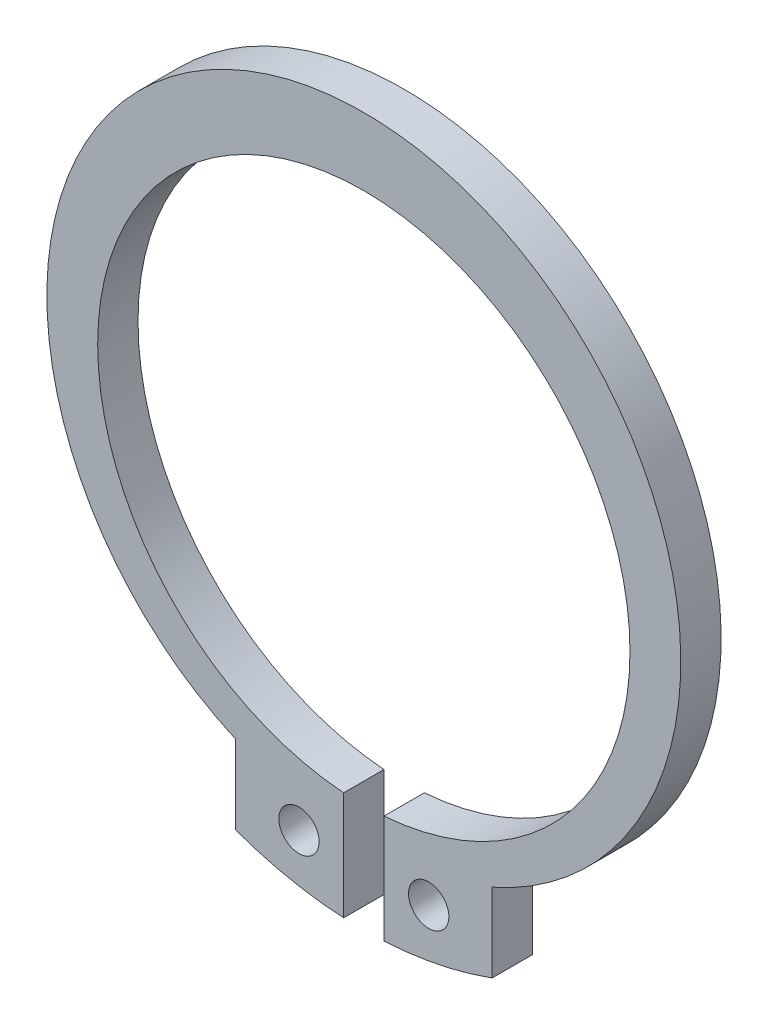
ISO-10303-21;
HEADER;
FILE_DESCRIPTION(('STEP AP214'),'2;1');
FILE_NAME('part.step','',(''),(''),'','','');
FILE_SCHEMA(('AUTOMOTIVE_DESIGN { 1 0 10303 214 1 1 1 1 }'));
ENDSEC;
DATA;
#1=APPLICATION_CONTEXT('core data for automotive mechanical design processes');
#2=APPLICATION_PROTOCOL_DEFINITION('international standard','automotive_design',2000,#1);
#3=PRODUCT_CONTEXT('',#1,'mechanical');
#4=PRODUCT('Part','Part','',(#3));
#5=PRODUCT_RELATED_PRODUCT_CATEGORY('part','',(#4));
#6=PRODUCT_DEFINITION_FORMATION('','',#4);
#7=PRODUCT_DEFINITION_CONTEXT('part definition',#1,'design');
#8=PRODUCT_DEFINITION('design','',#6,#7);
#9=PRODUCT_DEFINITION_SHAPE('','',#8);
#10=(LENGTH_UNIT() NAMED_UNIT(*) SI_UNIT(.MILLI.,.METRE.));
#11=(NAMED_UNIT(*) PLANE_ANGLE_UNIT() SI_UNIT($,.RADIAN.));
#12=(NAMED_UNIT(*) SI_UNIT($,.STERADIAN.) SOLID_ANGLE_UNIT());
#13=UNCERTAINTY_MEASURE_WITH_UNIT(LENGTH_MEASURE(1.E-05),#10,'distance_accuracy_value','');
#14=(GEOMETRIC_REPRESENTATION_CONTEXT(3) GLOBAL_UNCERTAINTY_ASSIGNED_CONTEXT((#13)) GLOBAL_UNIT_ASSIGNED_CONTEXT((#10,
#11,#12)) REPRESENTATION_CONTEXT('',''));
#15=CARTESIAN_POINT('',(0.,0.,0.));
#16=DIRECTION('',(0.,0.,1.));
#17=DIRECTION('',(1.,0.,0.));
#18=AXIS2_PLACEMENT_3D('',#15,#16,#17);
#19=CARTESIAN_POINT('',(-1.25,-23.166300956346,2.5));
#20=DIRECTION('',(-0.999999999999998,0.,0.));
#21=DIRECTION('',(0.,-0.999999999999998,0.));
#22=AXIS2_PLACEMENT_3D('',#19,#20,#21);
#23=PLANE('',#22);
#24=DIRECTION('',(0.,0.999999999999998,0.));
#25=VECTOR('',#24,1.);
#26=CARTESIAN_POINT('',(-1.25,-23.166300956346,0.));
#27=LINE('',#26,#25);
#28=CARTESIAN_POINT('',(-1.25,-23.166300956346,0.));
#29=VERTEX_POINT('',#28);
#30=CARTESIAN_POINT('',(-1.25,-16.4525833837729,0.));
#31=VERTEX_POINT('',#30);
#32=EDGE_CURVE('E112',#29,#31,#27,.T.);
#33=ORIENTED_EDGE('',*,*,#32,.T.);
#34=DIRECTION('',(0.,0.,-0.999999999999995));
#35=VECTOR('',#34,1.);
#36=CARTESIAN_POINT('',(-1.25,-16.4525833837729,2.5));
#37=LINE('',#36,#35);
#38=CARTESIAN_POINT('',(-1.25,-16.4525833837729,2.5));
#39=VERTEX_POINT('',#38);
#40=EDGE_CURVE('E13',#39,#31,#37,.T.);
#41=ORIENTED_EDGE('',*,*,#40,.F.);
#42=DIRECTION('',(0.,0.999999999999998,0.));
#43=VECTOR('',#42,1.);
#44=CARTESIAN_POINT('',(-1.25,-23.166300956346,2.5));
#45=LINE('',#44,#43);
#46=CARTESIAN_POINT('',(-1.25,-23.166300956346,2.5));
#47=VERTEX_POINT('',#46);
#48=EDGE_CURVE('E142',#47,#39,#45,.T.);
#49=ORIENTED_EDGE('',*,*,#48,.F.);
#50=DIRECTION('',(0.,0.,-0.999999999999995));
#51=VECTOR('',#50,1.);
#52=CARTESIAN_POINT('',(-1.25,-23.166300956346,2.5));
#53=LINE('',#52,#51);
#54=EDGE_CURVE('E165',#47,#29,#53,.T.);
#55=ORIENTED_EDGE('',*,*,#54,.T.);
#56=EDGE_LOOP('',(#33,#41,#49,#55));
#57=FACE_BOUND('',#56,.T.);
#58=ADVANCED_FACE('F25',(#57),#23,.F.);
#59=CARTESIAN_POINT('',(0.,0.,2.5));
#60=DIRECTION('',(0.,0.,-0.999999999999995));
#61=DIRECTION('',(-0.999999999999998,0.,0.));
#62=AXIS2_PLACEMENT_3D('',#59,#60,#61);
#63=CYLINDRICAL_SURFACE('',#62,16.5);
#64=CARTESIAN_POINT('',(0.,0.,0.));
#65=DIRECTION('',(0.,0.,0.999999999999995));
#66=DIRECTION('',(0.999999999999998,0.,0.));
#67=AXIS2_PLACEMENT_3D('',#64,#65,#66);
#68=CIRCLE('',#67,16.5);
#69=CARTESIAN_POINT('',(1.25,-16.4525833837729,0.));
#70=VERTEX_POINT('',#69);
#71=EDGE_CURVE('E105',#70,#31,#68,.T.);
#72=ORIENTED_EDGE('',*,*,#71,.F.);
#73=DIRECTION('',(0.,0.,-0.999999999999995));
#74=VECTOR('',#73,1.);
#75=CARTESIAN_POINT('',(1.25,-16.4525833837729,2.5));
#76=LINE('',#75,#74);
#77=CARTESIAN_POINT('',(1.25,-16.4525833837729,2.5));
#78=VERTEX_POINT('',#77);
#79=EDGE_CURVE('E34',#78,#70,#76,.T.);
#80=ORIENTED_EDGE('',*,*,#79,.F.);
#81=CARTESIAN_POINT('',(0.,0.,2.5));
#82=DIRECTION('',(0.,0.,0.999999999999995));
#83=DIRECTION('',(0.999999999999998,0.,0.));
#84=AXIS2_PLACEMENT_3D('',#81,#82,#83);
#85=CIRCLE('',#84,16.5);
#86=EDGE_CURVE('E146',#78,#39,#85,.T.);
#87=ORIENTED_EDGE('',*,*,#86,.T.);
#88=ORIENTED_EDGE('',*,*,#40,.T.);
#89=EDGE_LOOP('',(#72,#80,#87,#88));
#90=FACE_BOUND('',#89,.T.);
#91=ADVANCED_FACE('F106',(#90),#63,.F.);
#92=CARTESIAN_POINT('',(1.25,-23.166300956346,2.5));
#93=DIRECTION('',(-0.999999999999998,0.,0.));
#94=DIRECTION('',(0.,-0.999999999999998,0.));
#95=AXIS2_PLACEMENT_3D('',#92,#93,#94);
#96=PLANE('',#95);
#97=DIRECTION('',(0.,0.999999999999998,0.));
#98=VECTOR('',#97,1.);
#99=CARTESIAN_POINT('',(1.25,-23.166300956346,0.));
#100=LINE('',#99,#98);
#101=CARTESIAN_POINT('',(1.25,-23.166300956346,0.));
#102=VERTEX_POINT('',#101);
#103=EDGE_CURVE('E95',#102,#70,#100,.T.);
#104=ORIENTED_EDGE('',*,*,#103,.F.);
#105=DIRECTION('',(0.,0.,-0.999999999999995));
#106=VECTOR('',#105,1.);
#107=CARTESIAN_POINT('',(1.25,-23.166300956346,2.5));
#108=LINE('',#107,#106);
#109=CARTESIAN_POINT('',(1.25,-23.166300956346,2.5));
#110=VERTEX_POINT('',#109);
#111=EDGE_CURVE('E102',#110,#102,#108,.T.);
#112=ORIENTED_EDGE('',*,*,#111,.F.);
#113=DIRECTION('',(0.,0.999999999999998,0.));
#114=VECTOR('',#113,1.);
#115=CARTESIAN_POINT('',(1.25,-23.166300956346,2.5));
#116=LINE('',#115,#114);
#117=EDGE_CURVE('E97',#110,#78,#116,.T.);
#118=ORIENTED_EDGE('',*,*,#117,.T.);
#119=ORIENTED_EDGE('',*,*,#79,.T.);
#120=EDGE_LOOP('',(#104,#112,#118,#119));
#121=FACE_BOUND('',#120,.T.);
#122=ADVANCED_FACE('F93',(#121),#96,.T.);
#123=CARTESIAN_POINT('',(0.,0.,2.5));
#124=DIRECTION('',(0.,0.,-0.999999999999995));
#125=DIRECTION('',(-0.999999999999998,0.,0.));
#126=AXIS2_PLACEMENT_3D('',#123,#124,#125);
#127=CYLINDRICAL_SURFACE('',#126,23.2);
#128=CARTESIAN_POINT('',(0.,0.,0.));
#129=DIRECTION('',(0.,0.,0.999999999999995));
#130=DIRECTION('',(0.999999999999998,0.,0.));
#131=AXIS2_PLACEMENT_3D('',#128,#129,#130);
#132=CIRCLE('',#131,23.2);
#133=CARTESIAN_POINT('',(7.94999999999987,-21.7953550097263,0.));
#134=VERTEX_POINT('',#133);
#135=EDGE_CURVE('E117',#102,#134,#132,.T.);
#136=ORIENTED_EDGE('',*,*,#135,.T.);
#137=DIRECTION('',(0.,0.,-0.999999999999995));
#138=VECTOR('',#137,1.);
#139=CARTESIAN_POINT('',(7.94999999999987,-21.7953550097263,2.5));
#140=LINE('',#139,#138);
#141=CARTESIAN_POINT('',(7.94999999999987,-21.7953550097263,2.5));
#142=VERTEX_POINT('',#141);
#143=EDGE_CURVE('E180',#142,#134,#140,.T.);
#144=ORIENTED_EDGE('',*,*,#143,.F.);
#145=CARTESIAN_POINT('',(0.,0.,2.5));
#146=DIRECTION('',(0.,0.,0.999999999999995));
#147=DIRECTION('',(0.999999999999998,0.,0.));
#148=AXIS2_PLACEMENT_3D('',#145,#146,#147);
#149=CIRCLE('',#148,23.2);
#150=EDGE_CURVE('E151',#110,#142,#149,.T.);
#151=ORIENTED_EDGE('',*,*,#150,.F.);
#152=ORIENTED_EDGE('',*,*,#111,.T.);
#153=EDGE_LOOP('',(#136,#144,#151,#152));
#154=FACE_BOUND('',#153,.T.);
#155=ADVANCED_FACE('F239',(#154),#127,.T.);
#156=CARTESIAN_POINT('',(7.94999999999987,-21.7953550097263,2.5));
#157=DIRECTION('',(-0.999999999999998,0.,0.));
#158=DIRECTION('',(0.,0.,0.999999999999995));
#159=AXIS2_PLACEMENT_3D('',#156,#157,#158);
#160=PLANE('',#159);
#161=DIRECTION('',(0.,0.999999999999998,0.));
#162=VECTOR('',#161,1.);
#163=CARTESIAN_POINT('',(7.94999999999987,-21.7953550097263,0.));
#164=LINE('',#163,#162);
#165=CARTESIAN_POINT('',(7.94999999999987,-16.9199749582463,0.));
#166=VERTEX_POINT('',#165);
#167=EDGE_CURVE('E125',#134,#166,#164,.T.);
#168=ORIENTED_EDGE('',*,*,#167,.T.);
#169=DIRECTION('',(0.,0.,-0.999999999999995));
#170=VECTOR('',#169,1.);
#171=CARTESIAN_POINT('',(7.94999999999987,-16.9199749582463,2.5));
#172=LINE('',#171,#170);
#173=CARTESIAN_POINT('',(7.94999999999987,-16.9199749582463,2.5));
#174=VERTEX_POINT('',#173);
#175=EDGE_CURVE('E176',#174,#166,#172,.T.);
#176=ORIENTED_EDGE('',*,*,#175,.F.);
#177=DIRECTION('',(0.,0.999999999999998,0.));
#178=VECTOR('',#177,1.);
#179=CARTESIAN_POINT('',(7.94999999999987,-21.7953550097263,2.5));
#180=LINE('',#179,#178);
#181=EDGE_CURVE('E154',#142,#174,#180,.T.);
#182=ORIENTED_EDGE('',*,*,#181,.F.);
#183=ORIENTED_EDGE('',*,*,#143,.T.);
#184=EDGE_LOOP('',(#168,#176,#182,#183));
#185=FACE_BOUND('',#184,.T.);
#186=ADVANCED_FACE('F234',(#185),#160,.F.);
#187=CARTESIAN_POINT('',(0.,1.05,2.5));
#188=DIRECTION('',(0.,0.,-0.999999999999995));
#189=DIRECTION('',(-0.999999999999998,0.,0.));
#190=AXIS2_PLACEMENT_3D('',#187,#188,#189);
#191=CYLINDRICAL_SURFACE('',#190,19.65);
#192=CARTESIAN_POINT('',(0.,1.05,0.));
#193=DIRECTION('',(0.,0.,0.999999999999995));
#194=DIRECTION('',(0.999999999999998,0.,0.));
#195=AXIS2_PLACEMENT_3D('',#192,#193,#194);
#196=CIRCLE('',#195,19.65);
#197=CARTESIAN_POINT('',(-7.95000000000001,-16.9199749582463,0.));
#198=VERTEX_POINT('',#197);
#199=EDGE_CURVE('E131',#166,#198,#196,.T.);
#200=ORIENTED_EDGE('',*,*,#199,.T.);
#201=DIRECTION('',(0.,0.,-0.999999999999995));
#202=VECTOR('',#201,1.);
#203=CARTESIAN_POINT('',(-7.95000000000001,-16.9199749582463,2.5));
#204=LINE('',#203,#202);
#205=CARTESIAN_POINT('',(-7.95000000000001,-16.9199749582463,2.5));
#206=VERTEX_POINT('',#205);
#207=EDGE_CURVE('E173',#206,#198,#204,.T.);
#208=ORIENTED_EDGE('',*,*,#207,.F.);
#209=CARTESIAN_POINT('',(0.,1.05,2.5));
#210=DIRECTION('',(0.,0.,0.999999999999995));
#211=DIRECTION('',(0.999999999999998,0.,0.));
#212=AXIS2_PLACEMENT_3D('',#209,#210,#211);
#213=CIRCLE('',#212,19.65);
#214=EDGE_CURVE('E157',#174,#206,#213,.T.);
#215=ORIENTED_EDGE('',*,*,#214,.F.);
#216=ORIENTED_EDGE('',*,*,#175,.T.);
#217=EDGE_LOOP('',(#200,#208,#215,#216));
#218=FACE_BOUND('',#217,.T.);
#219=ADVANCED_FACE('F231',(#218),#191,.T.);
#220=CARTESIAN_POINT('',(-7.95000000000001,-21.7953550097263,2.5));
#221=DIRECTION('',(-0.999999999999998,0.,0.));
#222=DIRECTION('',(0.,0.,0.999999999999995));
#223=AXIS2_PLACEMENT_3D('',#220,#221,#222);
#224=PLANE('',#223);
#225=DIRECTION('',(0.,0.999999999999998,0.));
#226=VECTOR('',#225,1.);
#227=CARTESIAN_POINT('',(-7.95000000000001,-21.7953550097263,0.));
#228=LINE('',#227,#226);
#229=CARTESIAN_POINT('',(-7.95000000000001,-21.7953550097263,0.));
#230=VERTEX_POINT('',#229);
#231=EDGE_CURVE('E135',#230,#198,#228,.T.);
#232=ORIENTED_EDGE('',*,*,#231,.F.);
#233=DIRECTION('',(0.,0.,-0.999999999999995));
#234=VECTOR('',#233,1.);
#235=CARTESIAN_POINT('',(-7.95000000000001,-21.7953550097263,2.5));
#236=LINE('',#235,#234);
#237=CARTESIAN_POINT('',(-7.95000000000001,-21.7953550097263,2.5));
#238=VERTEX_POINT('',#237);
#239=EDGE_CURVE('E50',#238,#230,#236,.T.);
#240=ORIENTED_EDGE('',*,*,#239,.F.);
#241=DIRECTION('',(0.,0.999999999999998,0.));
#242=VECTOR('',#241,1.);
#243=CARTESIAN_POINT('',(-7.95000000000001,-21.7953550097263,2.5));
#244=LINE('',#243,#242);
#245=EDGE_CURVE('E160',#238,#206,#244,.T.);
#246=ORIENTED_EDGE('',*,*,#245,.T.);
#247=ORIENTED_EDGE('',*,*,#207,.T.);
#248=EDGE_LOOP('',(#232,#240,#246,#247));
#249=FACE_BOUND('',#248,.T.);
#250=ADVANCED_FACE('F227',(#249),#224,.T.);
#251=CARTESIAN_POINT('',(0.,0.,2.5));
#252=DIRECTION('',(0.,0.,-0.999999999999995));
#253=DIRECTION('',(-0.999999999999998,0.,0.));
#254=AXIS2_PLACEMENT_3D('',#251,#252,#253);
#255=CYLINDRICAL_SURFACE('',#254,23.2);
#256=CARTESIAN_POINT('',(0.,0.,0.));
#257=DIRECTION('',(0.,0.,0.999999999999995));
#258=DIRECTION('',(0.999999999999998,0.,0.));
#259=AXIS2_PLACEMENT_3D('',#256,#257,#258);
#260=CIRCLE('',#259,23.2);
#261=EDGE_CURVE('E139',#230,#29,#260,.T.);
#262=ORIENTED_EDGE('',*,*,#261,.T.);
#263=ORIENTED_EDGE('',*,*,#54,.F.);
#264=CARTESIAN_POINT('',(0.,0.,2.5));
#265=DIRECTION('',(0.,0.,0.999999999999995));
#266=DIRECTION('',(0.999999999999998,0.,0.));
#267=AXIS2_PLACEMENT_3D('',#264,#265,#266);
#268=CIRCLE('',#267,23.2);
#269=EDGE_CURVE('E42',#238,#47,#268,.T.);
#270=ORIENTED_EDGE('',*,*,#269,.F.);
#271=ORIENTED_EDGE('',*,*,#239,.T.);
#272=EDGE_LOOP('',(#262,#263,#270,#271));
#273=FACE_BOUND('',#272,.T.);
#274=ADVANCED_FACE('F242',(#273),#255,.T.);
#275=CARTESIAN_POINT('',(0.,0.,2.5));
#276=DIRECTION('',(0.,0.,0.999999999999995));
#277=DIRECTION('',(0.999999999999998,0.,0.));
#278=AXIS2_PLACEMENT_3D('',#275,#276,#277);
#279=PLANE('',#278);
#280=CARTESIAN_POINT('',(4.02,-19.85,2.5));
#281=DIRECTION('',(0.,0.,0.999999999999995));
#282=DIRECTION('',(0.999999999999998,0.,0.));
#283=AXIS2_PLACEMENT_3D('',#280,#281,#282);
#284=CIRCLE('',#283,1.25);
#285=CARTESIAN_POINT('',(4.02,-18.6,2.5));
#286=VERTEX_POINT('',#285);
#287=EDGE_CURVE('E187',#286,#286,#284,.T.);
#288=ORIENTED_EDGE('',*,*,#287,.F.);
#289=EDGE_LOOP('',(#288));
#290=FACE_BOUND('',#289,.T.);
#291=CARTESIAN_POINT('',(-4.02,-19.85,2.5));
#292=DIRECTION('',(0.,0.,0.999999999999995));
#293=DIRECTION('',(0.999999999999998,0.,0.));
#294=AXIS2_PLACEMENT_3D('',#291,#292,#293);
#295=CIRCLE('',#294,1.25);
#296=CARTESIAN_POINT('',(-4.02,-18.6,2.5));
#297=VERTEX_POINT('',#296);
#298=EDGE_CURVE('E145',#297,#297,#295,.T.);
#299=ORIENTED_EDGE('',*,*,#298,.F.);
#300=EDGE_LOOP('',(#299));
#301=FACE_BOUND('',#300,.T.);
#302=ORIENTED_EDGE('',*,*,#48,.T.);
#303=ORIENTED_EDGE('',*,*,#86,.F.);
#304=ORIENTED_EDGE('',*,*,#117,.F.);
#305=ORIENTED_EDGE('',*,*,#150,.T.);
#306=ORIENTED_EDGE('',*,*,#181,.T.);
#307=ORIENTED_EDGE('',*,*,#214,.T.);
#308=ORIENTED_EDGE('',*,*,#245,.F.);
#309=ORIENTED_EDGE('',*,*,#269,.T.);
#310=EDGE_LOOP('',(#302,#303,#304,#305,#306,#307,#308,#309));
#311=FACE_BOUND('',#310,.T.);
#312=ADVANCED_FACE('F240',(#290,#301,#311),#279,.T.);
#313=CARTESIAN_POINT('',(0.,0.,0.));
#314=DIRECTION('',(0.,0.,0.999999999999995));
#315=DIRECTION('',(0.999999999999998,0.,0.));
#316=AXIS2_PLACEMENT_3D('',#313,#314,#315);
#317=PLANE('',#316);
#318=CARTESIAN_POINT('',(4.02,-19.85,0.));
#319=DIRECTION('',(0.,0.,0.999999999999995));
#320=DIRECTION('',(0.999999999999998,0.,0.));
#321=AXIS2_PLACEMENT_3D('',#318,#319,#320);
#322=CIRCLE('',#321,1.25);
#323=CARTESIAN_POINT('',(4.02,-18.6,0.));
#324=VERTEX_POINT('',#323);
#325=EDGE_CURVE('E28',#324,#324,#322,.T.);
#326=ORIENTED_EDGE('',*,*,#325,.T.);
#327=EDGE_LOOP('',(#326));
#328=FACE_BOUND('',#327,.T.);
#329=CARTESIAN_POINT('',(-4.02,-19.85,0.));
#330=DIRECTION('',(0.,0.,0.999999999999995));
#331=DIRECTION('',(0.999999999999998,0.,0.));
#332=AXIS2_PLACEMENT_3D('',#329,#330,#331);
#333=CIRCLE('',#332,1.25);
#334=CARTESIAN_POINT('',(-4.02,-18.6,0.));
#335=VERTEX_POINT('',#334);
#336=EDGE_CURVE('E184',#335,#335,#333,.T.);
#337=ORIENTED_EDGE('',*,*,#336,.T.);
#338=EDGE_LOOP('',(#337));
#339=FACE_BOUND('',#338,.T.);
#340=ORIENTED_EDGE('',*,*,#32,.F.);
#341=ORIENTED_EDGE('',*,*,#261,.F.);
#342=ORIENTED_EDGE('',*,*,#231,.T.);
#343=ORIENTED_EDGE('',*,*,#199,.F.);
#344=ORIENTED_EDGE('',*,*,#167,.F.);
#345=ORIENTED_EDGE('',*,*,#135,.F.);
#346=ORIENTED_EDGE('',*,*,#103,.T.);
#347=ORIENTED_EDGE('',*,*,#71,.T.);
#348=EDGE_LOOP('',(#340,#341,#342,#343,#344,#345,#346,#347));
#349=FACE_BOUND('',#348,.T.);
#350=ADVANCED_FACE('F115',(#328,#339,#349),#317,.F.);
#351=CARTESIAN_POINT('',(-4.02,-19.85,-2.5));
#352=DIRECTION('',(0.,0.,0.999999999999995));
#353=DIRECTION('',(0.,0.999999999999998,0.));
#354=AXIS2_PLACEMENT_3D('',#351,#352,#353);
#355=CYLINDRICAL_SURFACE('',#354,1.25);
#356=CARTESIAN_POINT('',(-4.02,-18.6,2.5));
#357=CARTESIAN_POINT('',(-4.02,-18.6,2.47395833333333));
#358=CARTESIAN_POINT('',(-4.02,-18.6,2.44791666666666));
#359=CARTESIAN_POINT('',(-4.02,-18.6,2.39583333333333));
#360=CARTESIAN_POINT('',(-4.02,-18.6,2.36979166666666));
#361=CARTESIAN_POINT('',(-4.02,-18.6,2.31770833333333));
#362=CARTESIAN_POINT('',(-4.02,-18.6,2.29166666666666));
#363=CARTESIAN_POINT('',(-4.02,-18.6,2.23958333333333));
#364=CARTESIAN_POINT('',(-4.02,-18.6,2.21354166666666));
#365=CARTESIAN_POINT('',(-4.02,-18.6,2.16145833333333));
#366=CARTESIAN_POINT('',(-4.02,-18.6,2.13541666666666));
#367=CARTESIAN_POINT('',(-4.02,-18.6,2.08333333333333));
#368=CARTESIAN_POINT('',(-4.02,-18.6,2.05729166666666));
#369=CARTESIAN_POINT('',(-4.02,-18.6,2.00520833333333));
#370=CARTESIAN_POINT('',(-4.02,-18.6,1.97916666666666));
#371=CARTESIAN_POINT('',(-4.02,-18.6,1.92708333333333));
#372=CARTESIAN_POINT('',(-4.02,-18.6,1.90104166666666));
#373=CARTESIAN_POINT('',(-4.02,-18.6,1.84895833333333));
#374=CARTESIAN_POINT('',(-4.02,-18.6,1.82291666666666));
#375=CARTESIAN_POINT('',(-4.02,-18.6,1.77083333333333));
#376=CARTESIAN_POINT('',(-4.02,-18.6,1.74479166666666));
#377=CARTESIAN_POINT('',(-4.02,-18.6,1.69270833333333));
#378=CARTESIAN_POINT('',(-4.02,-18.6,1.66666666666666));
#379=CARTESIAN_POINT('',(-4.02,-18.6,1.61458333333333));
#380=CARTESIAN_POINT('',(-4.02,-18.6,1.58854166666666));
#381=CARTESIAN_POINT('',(-4.02,-18.6,1.53645833333333));
#382=CARTESIAN_POINT('',(-4.02,-18.6,1.51041666666666));
#383=CARTESIAN_POINT('',(-4.02,-18.6,1.45833333333333));
#384=CARTESIAN_POINT('',(-4.02,-18.6,1.43229166666666));
#385=CARTESIAN_POINT('',(-4.02,-18.6,1.38020833333333));
#386=CARTESIAN_POINT('',(-4.02,-18.6,1.35416666666666));
#387=CARTESIAN_POINT('',(-4.02,-18.6,1.30208333333333));
#388=CARTESIAN_POINT('',(-4.02,-18.6,1.27604166666666));
#389=CARTESIAN_POINT('',(-4.02,-18.6,1.22395833333333));
#390=CARTESIAN_POINT('',(-4.02,-18.6,1.19791666666666));
#391=CARTESIAN_POINT('',(-4.02,-18.6,1.14583333333333));
#392=CARTESIAN_POINT('',(-4.02,-18.6,1.11979166666666));
#393=CARTESIAN_POINT('',(-4.02,-18.6,1.06770833333333));
#394=CARTESIAN_POINT('',(-4.02,-18.6,1.04166666666666));
#395=CARTESIAN_POINT('',(-4.02,-18.6,0.98958333333333));
#396=CARTESIAN_POINT('',(-4.02,-18.6,0.963541666666663));
#397=CARTESIAN_POINT('',(-4.02,-18.6,0.91145833333333));
#398=CARTESIAN_POINT('',(-4.02,-18.6,0.885416666666663));
#399=CARTESIAN_POINT('',(-4.02,-18.6,0.83333333333333));
#400=CARTESIAN_POINT('',(-4.02,-18.6,0.807291666666664));
#401=CARTESIAN_POINT('',(-4.02,-18.6,0.75520833333333));
#402=CARTESIAN_POINT('',(-4.02,-18.6,0.729166666666663));
#403=CARTESIAN_POINT('',(-4.02,-18.6,0.67708333333333));
#404=CARTESIAN_POINT('',(-4.02,-18.6,0.651041666666664));
#405=CARTESIAN_POINT('',(-4.02,-18.6,0.59895833333333));
#406=CARTESIAN_POINT('',(-4.02,-18.6,0.572916666666664));
#407=CARTESIAN_POINT('',(-4.02,-18.6,0.52083333333333));
#408=CARTESIAN_POINT('',(-4.02,-18.6,0.494791666666664));
#409=CARTESIAN_POINT('',(-4.02,-18.6,0.44270833333333));
#410=CARTESIAN_POINT('',(-4.02,-18.6,0.416666666666663));
#411=CARTESIAN_POINT('',(-4.02,-18.6,0.36458333333333));
#412=CARTESIAN_POINT('',(-4.02,-18.6,0.338541666666663));
#413=CARTESIAN_POINT('',(-4.02,-18.6,0.28645833333333));
#414=CARTESIAN_POINT('',(-4.02,-18.6,0.260416666666663));
#415=CARTESIAN_POINT('',(-4.02,-18.6,0.20833333333333));
#416=CARTESIAN_POINT('',(-4.02,-18.6,0.182291666666663));
#417=CARTESIAN_POINT('',(-4.02,-18.6,0.13020833333333));
#418=CARTESIAN_POINT('',(-4.02,-18.6,0.104166666666664));
#419=CARTESIAN_POINT('',(-4.02,-18.6,0.0520833333333303));
#420=CARTESIAN_POINT('',(-4.02,-18.6,0.0260416666666636));
#421=CARTESIAN_POINT('',(-4.02,-18.6,0.));
#422=B_SPLINE_CURVE_WITH_KNOTS('',3,(#356,#357,#358,#359,#360,#361,#362,#363,#364,#365,#366,
#367,#368,#369,#370,#371,#372,#373,#374,#375,#376,#377,#378,#379,#380,#381,#382,#383,#384,#385,
#386,#387,#388,#389,#390,#391,#392,#393,#394,#395,#396,#397,#398,#399,#400,#401,#402,#403,#404,
#405,#406,#407,#408,#409,#410,#411,#412,#413,#414,#415,#416,#417,#418,#419,#420,#421),
.UNSPECIFIED.,.F.,.F.,(4,2,2,2,2,2,2,2,2,2,2,2,2,2,2,2,2,2,2,2,2,2,2,2,2,2,2,2,2,2,2,2,4),(0.,
0.0781250000000001,0.15625,0.234375,0.312499999999999,0.390625,0.46875,0.546875,
0.625000000000001,0.703125,0.781250000000001,0.859375,0.9375,1.015625,1.09375,1.171875,1.25,
1.328125,1.40625,1.484375,1.5625,1.640625,1.71875,1.796875,1.875,1.953125,2.03125,2.109375,
2.1875,2.265625,2.34375,2.421875,2.5),.UNSPECIFIED.);
#423=EDGE_CURVE('BSEAM210',#297,#335,#422,.T.);
#424=ORIENTED_EDGE('',*,*,#298,.T.);
#425=ORIENTED_EDGE('',*,*,#336,.F.);
#426=ORIENTED_EDGE('',*,*,#423,.T.);
#427=ORIENTED_EDGE('',*,*,#423,.F.);
#428=EDGE_LOOP('',(#424,#426,#425,#427));
#429=FACE_BOUND('',#428,.T.);
#430=ADVANCED_FACE('F210',(#429),#355,.F.);
#431=CARTESIAN_POINT('',(4.02,-19.85,-2.5));
#432=DIRECTION('',(0.,0.,0.999999999999995));
#433=DIRECTION('',(0.,0.999999999999998,0.));
#434=AXIS2_PLACEMENT_3D('',#431,#432,#433);
#435=CYLINDRICAL_SURFACE('',#434,1.25);
#436=CARTESIAN_POINT('',(4.02,-18.6,2.5));
#437=CARTESIAN_POINT('',(4.02,-18.6,2.47395833333333));
#438=CARTESIAN_POINT('',(4.02,-18.6,2.44791666666666));
#439=CARTESIAN_POINT('',(4.02,-18.6,2.39583333333333));
#440=CARTESIAN_POINT('',(4.02,-18.6,2.36979166666666));
#441=CARTESIAN_POINT('',(4.02,-18.6,2.31770833333333));
#442=CARTESIAN_POINT('',(4.02,-18.6,2.29166666666666));
#443=CARTESIAN_POINT('',(4.02,-18.6,2.23958333333333));
#444=CARTESIAN_POINT('',(4.02,-18.6,2.21354166666666));
#445=CARTESIAN_POINT('',(4.02,-18.6,2.16145833333333));
#446=CARTESIAN_POINT('',(4.02,-18.6,2.13541666666666));
#447=CARTESIAN_POINT('',(4.02,-18.6,2.08333333333333));
#448=CARTESIAN_POINT('',(4.02,-18.6,2.05729166666666));
#449=CARTESIAN_POINT('',(4.02,-18.6,2.00520833333333));
#450=CARTESIAN_POINT('',(4.02,-18.6,1.97916666666666));
#451=CARTESIAN_POINT('',(4.02,-18.6,1.92708333333333));
#452=CARTESIAN_POINT('',(4.02,-18.6,1.90104166666666));
#453=CARTESIAN_POINT('',(4.02,-18.6,1.84895833333333));
#454=CARTESIAN_POINT('',(4.02,-18.6,1.82291666666666));
#455=CARTESIAN_POINT('',(4.02,-18.6,1.77083333333333));
#456=CARTESIAN_POINT('',(4.02,-18.6,1.74479166666666));
#457=CARTESIAN_POINT('',(4.02,-18.6,1.69270833333333));
#458=CARTESIAN_POINT('',(4.02,-18.6,1.66666666666666));
#459=CARTESIAN_POINT('',(4.02,-18.6,1.61458333333333));
#460=CARTESIAN_POINT('',(4.02,-18.6,1.58854166666666));
#461=CARTESIAN_POINT('',(4.02,-18.6,1.53645833333333));
#462=CARTESIAN_POINT('',(4.02,-18.6,1.51041666666666));
#463=CARTESIAN_POINT('',(4.02,-18.6,1.45833333333333));
#464=CARTESIAN_POINT('',(4.02,-18.6,1.43229166666666));
#465=CARTESIAN_POINT('',(4.02,-18.6,1.38020833333333));
#466=CARTESIAN_POINT('',(4.02,-18.6,1.35416666666666));
#467=CARTESIAN_POINT('',(4.02,-18.6,1.30208333333333));
#468=CARTESIAN_POINT('',(4.02,-18.6,1.27604166666666));
#469=CARTESIAN_POINT('',(4.02,-18.6,1.22395833333333));
#470=CARTESIAN_POINT('',(4.02,-18.6,1.19791666666666));
#471=CARTESIAN_POINT('',(4.02,-18.6,1.14583333333333));
#472=CARTESIAN_POINT('',(4.02,-18.6,1.11979166666666));
#473=CARTESIAN_POINT('',(4.02,-18.6,1.06770833333333));
#474=CARTESIAN_POINT('',(4.02,-18.6,1.04166666666666));
#475=CARTESIAN_POINT('',(4.02,-18.6,0.98958333333333));
#476=CARTESIAN_POINT('',(4.02,-18.6,0.963541666666663));
#477=CARTESIAN_POINT('',(4.02,-18.6,0.91145833333333));
#478=CARTESIAN_POINT('',(4.02,-18.6,0.885416666666663));
#479=CARTESIAN_POINT('',(4.02,-18.6,0.83333333333333));
#480=CARTESIAN_POINT('',(4.02,-18.6,0.807291666666664));
#481=CARTESIAN_POINT('',(4.02,-18.6,0.75520833333333));
#482=CARTESIAN_POINT('',(4.02,-18.6,0.729166666666663));
#483=CARTESIAN_POINT('',(4.02,-18.6,0.67708333333333));
#484=CARTESIAN_POINT('',(4.02,-18.6,0.651041666666664));
#485=CARTESIAN_POINT('',(4.02,-18.6,0.59895833333333));
#486=CARTESIAN_POINT('',(4.02,-18.6,0.572916666666664));
#487=CARTESIAN_POINT('',(4.02,-18.6,0.52083333333333));
#488=CARTESIAN_POINT('',(4.02,-18.6,0.494791666666664));
#489=CARTESIAN_POINT('',(4.02,-18.6,0.44270833333333));
#490=CARTESIAN_POINT('',(4.02,-18.6,0.416666666666663));
#491=CARTESIAN_POINT('',(4.02,-18.6,0.36458333333333));
#492=CARTESIAN_POINT('',(4.02,-18.6,0.338541666666663));
#493=CARTESIAN_POINT('',(4.02,-18.6,0.28645833333333));
#494=CARTESIAN_POINT('',(4.02,-18.6,0.260416666666663));
#495=CARTESIAN_POINT('',(4.02,-18.6,0.20833333333333));
#496=CARTESIAN_POINT('',(4.02,-18.6,0.182291666666663));
#497=CARTESIAN_POINT('',(4.02,-18.6,0.13020833333333));
#498=CARTESIAN_POINT('',(4.02,-18.6,0.104166666666664));
#499=CARTESIAN_POINT('',(4.02,-18.6,0.0520833333333303));
#500=CARTESIAN_POINT('',(4.02,-18.6,0.0260416666666636));
#501=CARTESIAN_POINT('',(4.02,-18.6,0.));
#502=B_SPLINE_CURVE_WITH_KNOTS('',3,(#436,#437,#438,#439,#440,#441,#442,#443,#444,#445,#446,
#447,#448,#449,#450,#451,#452,#453,#454,#455,#456,#457,#458,#459,#460,#461,#462,#463,#464,#465,
#466,#467,#468,#469,#470,#471,#472,#473,#474,#475,#476,#477,#478,#479,#480,#481,#482,#483,#484,
#485,#486,#487,#488,#489,#490,#491,#492,#493,#494,#495,#496,#497,#498,#499,#500,#501),
.UNSPECIFIED.,.F.,.F.,(4,2,2,2,2,2,2,2,2,2,2,2,2,2,2,2,2,2,2,2,2,2,2,2,2,2,2,2,2,2,2,2,4),(0.,
0.0781250000000001,0.15625,0.234375,0.312499999999999,0.390625,0.46875,0.546875,
0.625000000000001,0.703125,0.781250000000001,0.859375,0.9375,1.015625,1.09375,1.171875,1.25,
1.328125,1.40625,1.484375,1.5625,1.640625,1.71875,1.796875,1.875,1.953125,2.03125,2.109375,
2.1875,2.265625,2.34375,2.421875,2.5),.UNSPECIFIED.);
#503=EDGE_CURVE('BSEAM208',#286,#324,#502,.T.);
#504=ORIENTED_EDGE('',*,*,#287,.T.);
#505=ORIENTED_EDGE('',*,*,#325,.F.);
#506=ORIENTED_EDGE('',*,*,#503,.T.);
#507=ORIENTED_EDGE('',*,*,#503,.F.);
#508=EDGE_LOOP('',(#504,#506,#505,#507));
#509=FACE_BOUND('',#508,.T.);
#510=ADVANCED_FACE('F208',(#509),#435,.F.);
#511=CLOSED_SHELL('',(#58,#91,#122,#155,#186,#219,#250,#274,#312,#350,#430,#510));
#512=MANIFOLD_SOLID_BREP('B1',#511);
#513=ADVANCED_BREP_SHAPE_REPRESENTATION('',(#18,#512),#14);
#514=SHAPE_DEFINITION_REPRESENTATION(#9,#513);
ENDSEC;
END-ISO-10303-21;
